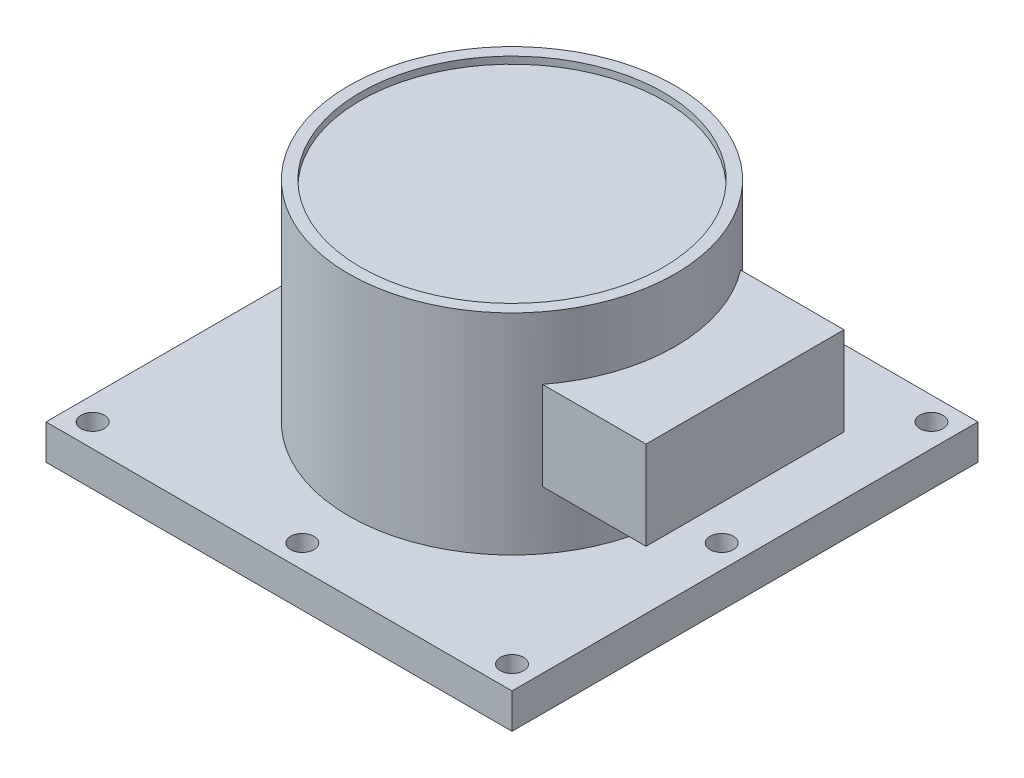
ISO-10303-21;
HEADER;
FILE_DESCRIPTION(('STEP AP214'),'2;1');
FILE_NAME('part.step','',(''),(''),'','','');
FILE_SCHEMA(('AUTOMOTIVE_DESIGN { 1 0 10303 214 1 1 1 1 }'));
ENDSEC;
DATA;
#1=APPLICATION_CONTEXT('core data for automotive mechanical design processes');
#2=APPLICATION_PROTOCOL_DEFINITION('international standard','automotive_design',2000,#1);
#3=PRODUCT_CONTEXT('',#1,'mechanical');
#4=PRODUCT('Part','Part','',(#3));
#5=PRODUCT_RELATED_PRODUCT_CATEGORY('part','',(#4));
#6=PRODUCT_DEFINITION_FORMATION('','',#4);
#7=PRODUCT_DEFINITION_CONTEXT('part definition',#1,'design');
#8=PRODUCT_DEFINITION('design','',#6,#7);
#9=PRODUCT_DEFINITION_SHAPE('','',#8);
#10=(LENGTH_UNIT() NAMED_UNIT(*) SI_UNIT(.MILLI.,.METRE.));
#11=(NAMED_UNIT(*) PLANE_ANGLE_UNIT() SI_UNIT($,.RADIAN.));
#12=(NAMED_UNIT(*) SI_UNIT($,.STERADIAN.) SOLID_ANGLE_UNIT());
#13=UNCERTAINTY_MEASURE_WITH_UNIT(LENGTH_MEASURE(1.E-05),#10,'distance_accuracy_value','');
#14=(GEOMETRIC_REPRESENTATION_CONTEXT(3) GLOBAL_UNCERTAINTY_ASSIGNED_CONTEXT((#13)) GLOBAL_UNIT_ASSIGNED_CONTEXT((#10,
#11,#12)) REPRESENTATION_CONTEXT('',''));
#15=CARTESIAN_POINT('',(0.,0.,0.));
#16=DIRECTION('',(0.,0.,1.));
#17=DIRECTION('',(1.,0.,0.));
#18=AXIS2_PLACEMENT_3D('',#15,#16,#17);
#19=CARTESIAN_POINT('',(0.,105.,0.));
#20=DIRECTION('',(0.,-1.,0.));
#21=DIRECTION('',(0.,0.,-1.));
#22=AXIS2_PLACEMENT_3D('',#19,#20,#21);
#23=CYLINDRICAL_SURFACE('',#22,70.);
#24=CARTESIAN_POINT('',(0.,15.,0.));
#25=DIRECTION('',(0.,1.,0.));
#26=DIRECTION('',(0.,0.,1.));
#27=AXIS2_PLACEMENT_3D('',#24,#25,#26);
#28=CIRCLE('',#27,70.);
#29=CARTESIAN_POINT('',(0.,15.,70.));
#30=VERTEX_POINT('',#29);
#31=EDGE_CURVE('E146',#30,#30,#28,.T.);
#32=ORIENTED_EDGE('',*,*,#31,.T.);
#33=EDGE_LOOP('',(#32));
#34=FACE_BOUND('',#33,.T.);
#35=CARTESIAN_POINT('',(0.,105.,0.));
#36=DIRECTION('',(0.,1.,0.));
#37=DIRECTION('',(0.,0.,1.));
#38=AXIS2_PLACEMENT_3D('',#35,#36,#37);
#39=CIRCLE('',#38,70.);
#40=CARTESIAN_POINT('',(0.,105.,70.));
#41=VERTEX_POINT('',#40);
#42=EDGE_CURVE('E141',#41,#41,#39,.T.);
#43=ORIENTED_EDGE('',*,*,#42,.F.);
#44=EDGE_LOOP('',(#43));
#45=FACE_BOUND('',#44,.T.);
#46=DIRECTION('',(0.,-1.,0.));
#47=VECTOR('',#46,1.);
#48=CARTESIAN_POINT('',(55.6214886532175,105.,42.5));
#49=LINE('',#48,#47);
#50=CARTESIAN_POINT('',(55.6214886532175,78.,42.5));
#51=VERTEX_POINT('',#50);
#52=CARTESIAN_POINT('',(55.6214886532175,40.,42.5));
#53=VERTEX_POINT('',#52);
#54=EDGE_CURVE('E11',#51,#53,#49,.T.);
#55=ORIENTED_EDGE('',*,*,#54,.F.);
#56=CARTESIAN_POINT('',(0.,78.,0.));
#57=DIRECTION('',(0.,1.,0.));
#58=DIRECTION('',(0.,0.,1.));
#59=AXIS2_PLACEMENT_3D('',#56,#57,#58);
#60=CIRCLE('',#59,70.);
#61=CARTESIAN_POINT('',(55.6214886532175,78.,-42.5));
#62=VERTEX_POINT('',#61);
#63=EDGE_CURVE('E149',#51,#62,#60,.T.);
#64=ORIENTED_EDGE('',*,*,#63,.T.);
#65=DIRECTION('',(0.,-1.,0.));
#66=VECTOR('',#65,1.);
#67=CARTESIAN_POINT('',(55.6214886532175,105.,-42.5));
#68=LINE('',#67,#66);
#69=CARTESIAN_POINT('',(55.6214886532175,40.,-42.5));
#70=VERTEX_POINT('',#69);
#71=EDGE_CURVE('E174',#62,#70,#68,.T.);
#72=ORIENTED_EDGE('',*,*,#71,.T.);
#73=CARTESIAN_POINT('',(0.,40.,0.));
#74=DIRECTION('',(0.,1.,0.));
#75=DIRECTION('',(0.,0.,1.));
#76=AXIS2_PLACEMENT_3D('',#73,#74,#75);
#77=CIRCLE('',#76,70.);
#78=EDGE_CURVE('E42',#53,#70,#77,.T.);
#79=ORIENTED_EDGE('',*,*,#78,.F.);
#80=EDGE_LOOP('',(#55,#64,#72,#79));
#81=FACE_BOUND('',#80,.T.);
#82=ADVANCED_FACE('F34',(#34,#45,#81),#23,.T.);
#83=CARTESIAN_POINT('',(100.,15.,100.));
#84=DIRECTION('',(-1.,0.,0.));
#85=DIRECTION('',(0.,0.,1.));
#86=AXIS2_PLACEMENT_3D('',#83,#84,#85);
#87=PLANE('',#86);
#88=DIRECTION('',(0.,0.,-1.));
#89=VECTOR('',#88,1.);
#90=CARTESIAN_POINT('',(100.,0.,100.));
#91=LINE('',#90,#89);
#92=CARTESIAN_POINT('',(100.,0.,100.));
#93=VERTEX_POINT('',#92);
#94=CARTESIAN_POINT('',(100.,0.,-100.));
#95=VERTEX_POINT('',#94);
#96=EDGE_CURVE('E145',#93,#95,#91,.T.);
#97=ORIENTED_EDGE('',*,*,#96,.T.);
#98=DIRECTION('',(0.,-1.,0.));
#99=VECTOR('',#98,1.);
#100=CARTESIAN_POINT('',(100.,15.,-100.));
#101=LINE('',#100,#99);
#102=CARTESIAN_POINT('',(100.,15.,-100.));
#103=VERTEX_POINT('',#102);
#104=EDGE_CURVE('E150',#103,#95,#101,.T.);
#105=ORIENTED_EDGE('',*,*,#104,.F.);
#106=DIRECTION('',(0.,0.,-1.));
#107=VECTOR('',#106,1.);
#108=CARTESIAN_POINT('',(100.,15.,100.));
#109=LINE('',#108,#107);
#110=CARTESIAN_POINT('',(100.,15.,100.));
#111=VERTEX_POINT('',#110);
#112=EDGE_CURVE('E151',#111,#103,#109,.T.);
#113=ORIENTED_EDGE('',*,*,#112,.F.);
#114=DIRECTION('',(0.,-1.,0.));
#115=VECTOR('',#114,1.);
#116=CARTESIAN_POINT('',(100.,15.,100.));
#117=LINE('',#116,#115);
#118=EDGE_CURVE('E157',#111,#93,#117,.T.);
#119=ORIENTED_EDGE('',*,*,#118,.T.);
#120=EDGE_LOOP('',(#97,#105,#113,#119));
#121=FACE_BOUND('',#120,.T.);
#122=ADVANCED_FACE('F36',(#121),#87,.F.);
#123=CARTESIAN_POINT('',(-100.,15.,-100.));
#124=DIRECTION('',(0.,0.,1.));
#125=DIRECTION('',(1.,0.,0.));
#126=AXIS2_PLACEMENT_3D('',#123,#124,#125);
#127=PLANE('',#126);
#128=DIRECTION('',(-1.,0.,0.));
#129=VECTOR('',#128,1.);
#130=CARTESIAN_POINT('',(-100.,0.,-100.));
#131=LINE('',#130,#129);
#132=CARTESIAN_POINT('',(-100.,0.,-100.));
#133=VERTEX_POINT('',#132);
#134=EDGE_CURVE('E160',#95,#133,#131,.T.);
#135=ORIENTED_EDGE('',*,*,#134,.T.);
#136=DIRECTION('',(0.,-1.,0.));
#137=VECTOR('',#136,1.);
#138=CARTESIAN_POINT('',(-100.,15.,-100.));
#139=LINE('',#138,#137);
#140=CARTESIAN_POINT('',(-100.,15.,-100.));
#141=VERTEX_POINT('',#140);
#142=EDGE_CURVE('E168',#141,#133,#139,.T.);
#143=ORIENTED_EDGE('',*,*,#142,.F.);
#144=DIRECTION('',(-1.,0.,0.));
#145=VECTOR('',#144,1.);
#146=CARTESIAN_POINT('',(-100.,15.,-100.));
#147=LINE('',#146,#145);
#148=EDGE_CURVE('E87',#103,#141,#147,.T.);
#149=ORIENTED_EDGE('',*,*,#148,.F.);
#150=ORIENTED_EDGE('',*,*,#104,.T.);
#151=EDGE_LOOP('',(#135,#143,#149,#150));
#152=FACE_BOUND('',#151,.T.);
#153=ADVANCED_FACE('F266',(#152),#127,.F.);
#154=CARTESIAN_POINT('',(-100.,15.,100.));
#155=DIRECTION('',(1.,0.,0.));
#156=DIRECTION('',(0.,0.,-1.));
#157=AXIS2_PLACEMENT_3D('',#154,#155,#156);
#158=PLANE('',#157);
#159=DIRECTION('',(0.,0.,1.));
#160=VECTOR('',#159,1.);
#161=CARTESIAN_POINT('',(-100.,0.,100.));
#162=LINE('',#161,#160);
#163=CARTESIAN_POINT('',(-100.,0.,100.));
#164=VERTEX_POINT('',#163);
#165=EDGE_CURVE('E162',#133,#164,#162,.T.);
#166=ORIENTED_EDGE('',*,*,#165,.T.);
#167=DIRECTION('',(0.,-1.,0.));
#168=VECTOR('',#167,1.);
#169=CARTESIAN_POINT('',(-100.,15.,100.));
#170=LINE('',#169,#168);
#171=CARTESIAN_POINT('',(-100.,15.,100.));
#172=VERTEX_POINT('',#171);
#173=EDGE_CURVE('E166',#172,#164,#170,.T.);
#174=ORIENTED_EDGE('',*,*,#173,.F.);
#175=DIRECTION('',(0.,0.,1.));
#176=VECTOR('',#175,1.);
#177=CARTESIAN_POINT('',(-100.,15.,100.));
#178=LINE('',#177,#176);
#179=EDGE_CURVE('E154',#141,#172,#178,.T.);
#180=ORIENTED_EDGE('',*,*,#179,.F.);
#181=ORIENTED_EDGE('',*,*,#142,.T.);
#182=EDGE_LOOP('',(#166,#174,#180,#181));
#183=FACE_BOUND('',#182,.T.);
#184=ADVANCED_FACE('F265',(#183),#158,.F.);
#185=CARTESIAN_POINT('',(-100.,15.,100.));
#186=DIRECTION('',(0.,0.,-1.));
#187=DIRECTION('',(-1.,0.,0.));
#188=AXIS2_PLACEMENT_3D('',#185,#186,#187);
#189=PLANE('',#188);
#190=DIRECTION('',(1.,0.,0.));
#191=VECTOR('',#190,1.);
#192=CARTESIAN_POINT('',(-100.,0.,100.));
#193=LINE('',#192,#191);
#194=EDGE_CURVE('E79',#164,#93,#193,.T.);
#195=ORIENTED_EDGE('',*,*,#194,.T.);
#196=ORIENTED_EDGE('',*,*,#118,.F.);
#197=DIRECTION('',(1.,0.,0.));
#198=VECTOR('',#197,1.);
#199=CARTESIAN_POINT('',(-100.,15.,100.));
#200=LINE('',#199,#198);
#201=EDGE_CURVE('E58',#172,#111,#200,.T.);
#202=ORIENTED_EDGE('',*,*,#201,.F.);
#203=ORIENTED_EDGE('',*,*,#173,.T.);
#204=EDGE_LOOP('',(#195,#196,#202,#203));
#205=FACE_BOUND('',#204,.T.);
#206=ADVANCED_FACE('F261',(#205),#189,.F.);
#207=CARTESIAN_POINT('',(0.,15.,0.));
#208=DIRECTION('',(0.,-1.,0.));
#209=DIRECTION('',(0.,0.,-1.));
#210=AXIS2_PLACEMENT_3D('',#207,#208,#209);
#211=PLANE('',#210);
#212=CARTESIAN_POINT('',(0.,15.,90.));
#213=DIRECTION('',(0.,-1.,0.));
#214=DIRECTION('',(0.,0.,-1.));
#215=AXIS2_PLACEMENT_3D('',#212,#213,#214);
#216=CIRCLE('',#215,5.);
#217=CARTESIAN_POINT('',(0.,15.,85.));
#218=VERTEX_POINT('',#217);
#219=EDGE_CURVE('E188',#218,#218,#216,.T.);
#220=ORIENTED_EDGE('',*,*,#219,.T.);
#221=EDGE_LOOP('',(#220));
#222=FACE_BOUND('',#221,.T.);
#223=CARTESIAN_POINT('',(90.,15.,90.));
#224=DIRECTION('',(0.,-1.,0.));
#225=DIRECTION('',(0.,0.,-1.));
#226=AXIS2_PLACEMENT_3D('',#223,#224,#225);
#227=CIRCLE('',#226,5.00000000000001);
#228=CARTESIAN_POINT('',(90.,15.,85.));
#229=VERTEX_POINT('',#228);
#230=EDGE_CURVE('E207',#229,#229,#227,.T.);
#231=ORIENTED_EDGE('',*,*,#230,.T.);
#232=EDGE_LOOP('',(#231));
#233=FACE_BOUND('',#232,.T.);
#234=CARTESIAN_POINT('',(90.,15.,0.));
#235=DIRECTION('',(0.,-1.,0.));
#236=DIRECTION('',(0.,0.,-1.));
#237=AXIS2_PLACEMENT_3D('',#234,#235,#236);
#238=CIRCLE('',#237,5.);
#239=CARTESIAN_POINT('',(90.,15.,-5.00000000000002));
#240=VERTEX_POINT('',#239);
#241=EDGE_CURVE('E201',#240,#240,#238,.T.);
#242=ORIENTED_EDGE('',*,*,#241,.T.);
#243=EDGE_LOOP('',(#242));
#244=FACE_BOUND('',#243,.T.);
#245=CARTESIAN_POINT('',(90.,15.,-90.));
#246=DIRECTION('',(0.,-1.,0.));
#247=DIRECTION('',(0.,0.,-1.));
#248=AXIS2_PLACEMENT_3D('',#245,#246,#247);
#249=CIRCLE('',#248,5.00000000000001);
#250=CARTESIAN_POINT('',(90.,15.,-95.));
#251=VERTEX_POINT('',#250);
#252=EDGE_CURVE('E194',#251,#251,#249,.T.);
#253=ORIENTED_EDGE('',*,*,#252,.T.);
#254=EDGE_LOOP('',(#253));
#255=FACE_BOUND('',#254,.T.);
#256=CARTESIAN_POINT('',(-90.,15.,-90.));
#257=DIRECTION('',(0.,-1.,0.));
#258=DIRECTION('',(0.,0.,-1.));
#259=AXIS2_PLACEMENT_3D('',#256,#257,#258);
#260=CIRCLE('',#259,5.00000000000001);
#261=CARTESIAN_POINT('',(-90.,15.,-95.));
#262=VERTEX_POINT('',#261);
#263=EDGE_CURVE('E195',#262,#262,#260,.T.);
#264=ORIENTED_EDGE('',*,*,#263,.T.);
#265=EDGE_LOOP('',(#264));
#266=FACE_BOUND('',#265,.T.);
#267=CARTESIAN_POINT('',(-90.,15.,0.));
#268=DIRECTION('',(0.,-1.,0.));
#269=DIRECTION('',(0.,0.,-1.));
#270=AXIS2_PLACEMENT_3D('',#267,#268,#269);
#271=CIRCLE('',#270,5.);
#272=CARTESIAN_POINT('',(-90.,15.,-5.00000000000002));
#273=VERTEX_POINT('',#272);
#274=EDGE_CURVE('E224',#273,#273,#271,.T.);
#275=ORIENTED_EDGE('',*,*,#274,.T.);
#276=EDGE_LOOP('',(#275));
#277=FACE_BOUND('',#276,.T.);
#278=CARTESIAN_POINT('',(0.,15.,-90.));
#279=DIRECTION('',(0.,-1.,0.));
#280=DIRECTION('',(0.,0.,-1.));
#281=AXIS2_PLACEMENT_3D('',#278,#279,#280);
#282=CIRCLE('',#281,5.);
#283=CARTESIAN_POINT('',(0.,15.,-95.));
#284=VERTEX_POINT('',#283);
#285=EDGE_CURVE('E218',#284,#284,#282,.T.);
#286=ORIENTED_EDGE('',*,*,#285,.T.);
#287=EDGE_LOOP('',(#286));
#288=FACE_BOUND('',#287,.T.);
#289=CARTESIAN_POINT('',(-90.,15.,90.));
#290=DIRECTION('',(0.,-1.,0.));
#291=DIRECTION('',(0.,0.,-1.));
#292=AXIS2_PLACEMENT_3D('',#289,#290,#291);
#293=CIRCLE('',#292,5.00000000000001);
#294=CARTESIAN_POINT('',(-90.,15.,85.));
#295=VERTEX_POINT('',#294);
#296=EDGE_CURVE('E128',#295,#295,#293,.T.);
#297=ORIENTED_EDGE('',*,*,#296,.T.);
#298=EDGE_LOOP('',(#297));
#299=FACE_BOUND('',#298,.T.);
#300=ORIENTED_EDGE('',*,*,#31,.F.);
#301=EDGE_LOOP('',(#300));
#302=FACE_BOUND('',#301,.T.);
#303=ORIENTED_EDGE('',*,*,#112,.T.);
#304=ORIENTED_EDGE('',*,*,#148,.T.);
#305=ORIENTED_EDGE('',*,*,#179,.T.);
#306=ORIENTED_EDGE('',*,*,#201,.T.);
#307=EDGE_LOOP('',(#303,#304,#305,#306));
#308=FACE_BOUND('',#307,.T.);
#309=ADVANCED_FACE('F233',(#222,#233,#244,#255,#266,#277,#288,#299,#302,#308),#211,.F.);
#310=CARTESIAN_POINT('',(0.,0.,0.));
#311=DIRECTION('',(0.,-1.,0.));
#312=DIRECTION('',(0.,0.,-1.));
#313=AXIS2_PLACEMENT_3D('',#310,#311,#312);
#314=PLANE('',#313);
#315=CARTESIAN_POINT('',(0.,0.,90.));
#316=DIRECTION('',(0.,-1.,0.));
#317=DIRECTION('',(0.,0.,-1.));
#318=AXIS2_PLACEMENT_3D('',#315,#316,#317);
#319=CIRCLE('',#318,5.);
#320=CARTESIAN_POINT('',(0.,0.,85.));
#321=VERTEX_POINT('',#320);
#322=EDGE_CURVE('E210',#321,#321,#319,.T.);
#323=ORIENTED_EDGE('',*,*,#322,.F.);
#324=EDGE_LOOP('',(#323));
#325=FACE_BOUND('',#324,.T.);
#326=CARTESIAN_POINT('',(90.,0.,90.));
#327=DIRECTION('',(0.,-1.,0.));
#328=DIRECTION('',(0.,0.,-1.));
#329=AXIS2_PLACEMENT_3D('',#326,#327,#328);
#330=CIRCLE('',#329,5.00000000000001);
#331=CARTESIAN_POINT('',(90.,0.,85.));
#332=VERTEX_POINT('',#331);
#333=EDGE_CURVE('E204',#332,#332,#330,.T.);
#334=ORIENTED_EDGE('',*,*,#333,.F.);
#335=EDGE_LOOP('',(#334));
#336=FACE_BOUND('',#335,.T.);
#337=CARTESIAN_POINT('',(90.,0.,0.));
#338=DIRECTION('',(0.,-1.,0.));
#339=DIRECTION('',(0.,0.,-1.));
#340=AXIS2_PLACEMENT_3D('',#337,#338,#339);
#341=CIRCLE('',#340,5.);
#342=CARTESIAN_POINT('',(90.,0.,-5.00000000000002));
#343=VERTEX_POINT('',#342);
#344=EDGE_CURVE('E198',#343,#343,#341,.T.);
#345=ORIENTED_EDGE('',*,*,#344,.F.);
#346=EDGE_LOOP('',(#345));
#347=FACE_BOUND('',#346,.T.);
#348=CARTESIAN_POINT('',(90.,0.,-90.));
#349=DIRECTION('',(0.,-1.,0.));
#350=DIRECTION('',(0.,0.,-1.));
#351=AXIS2_PLACEMENT_3D('',#348,#349,#350);
#352=CIRCLE('',#351,5.00000000000001);
#353=CARTESIAN_POINT('',(90.,0.,-95.));
#354=VERTEX_POINT('',#353);
#355=EDGE_CURVE('E191',#354,#354,#352,.T.);
#356=ORIENTED_EDGE('',*,*,#355,.F.);
#357=EDGE_LOOP('',(#356));
#358=FACE_BOUND('',#357,.T.);
#359=CARTESIAN_POINT('',(-90.,0.,-90.));
#360=DIRECTION('',(0.,-1.,0.));
#361=DIRECTION('',(0.,0.,-1.));
#362=AXIS2_PLACEMENT_3D('',#359,#360,#361);
#363=CIRCLE('',#362,5.00000000000001);
#364=CARTESIAN_POINT('',(-90.,0.,-95.));
#365=VERTEX_POINT('',#364);
#366=EDGE_CURVE('E227',#365,#365,#363,.T.);
#367=ORIENTED_EDGE('',*,*,#366,.F.);
#368=EDGE_LOOP('',(#367));
#369=FACE_BOUND('',#368,.T.);
#370=CARTESIAN_POINT('',(-90.,0.,0.));
#371=DIRECTION('',(0.,-1.,0.));
#372=DIRECTION('',(0.,0.,-1.));
#373=AXIS2_PLACEMENT_3D('',#370,#371,#372);
#374=CIRCLE('',#373,5.);
#375=CARTESIAN_POINT('',(-90.,0.,-5.00000000000002));
#376=VERTEX_POINT('',#375);
#377=EDGE_CURVE('E221',#376,#376,#374,.T.);
#378=ORIENTED_EDGE('',*,*,#377,.F.);
#379=EDGE_LOOP('',(#378));
#380=FACE_BOUND('',#379,.T.);
#381=CARTESIAN_POINT('',(0.,0.,-90.));
#382=DIRECTION('',(0.,-1.,0.));
#383=DIRECTION('',(0.,0.,-1.));
#384=AXIS2_PLACEMENT_3D('',#381,#382,#383);
#385=CIRCLE('',#384,5.);
#386=CARTESIAN_POINT('',(0.,0.,-95.));
#387=VERTEX_POINT('',#386);
#388=EDGE_CURVE('E215',#387,#387,#385,.T.);
#389=ORIENTED_EDGE('',*,*,#388,.F.);
#390=EDGE_LOOP('',(#389));
#391=FACE_BOUND('',#390,.T.);
#392=CARTESIAN_POINT('',(-90.,0.,90.));
#393=DIRECTION('',(0.,-1.,0.));
#394=DIRECTION('',(0.,0.,-1.));
#395=AXIS2_PLACEMENT_3D('',#392,#393,#394);
#396=CIRCLE('',#395,5.00000000000001);
#397=CARTESIAN_POINT('',(-90.,0.,85.));
#398=VERTEX_POINT('',#397);
#399=EDGE_CURVE('E185',#398,#398,#396,.T.);
#400=ORIENTED_EDGE('',*,*,#399,.F.);
#401=EDGE_LOOP('',(#400));
#402=FACE_BOUND('',#401,.T.);
#403=ORIENTED_EDGE('',*,*,#96,.F.);
#404=ORIENTED_EDGE('',*,*,#194,.F.);
#405=ORIENTED_EDGE('',*,*,#165,.F.);
#406=ORIENTED_EDGE('',*,*,#134,.F.);
#407=EDGE_LOOP('',(#403,#404,#405,#406));
#408=FACE_BOUND('',#407,.T.);
#409=ADVANCED_FACE('F244',(#325,#336,#347,#358,#369,#380,#391,#402,#408),#314,.T.);
#410=CARTESIAN_POINT('',(0.,105.,0.));
#411=DIRECTION('',(0.,1.,0.));
#412=DIRECTION('',(0.,0.,1.));
#413=AXIS2_PLACEMENT_3D('',#410,#411,#412);
#414=PLANE('',#413);
#415=CARTESIAN_POINT('',(0.,105.,0.));
#416=DIRECTION('',(0.,1.,0.));
#417=DIRECTION('',(0.,0.,1.));
#418=AXIS2_PLACEMENT_3D('',#415,#416,#417);
#419=CIRCLE('',#418,65.);
#420=CARTESIAN_POINT('',(0.,105.,65.));
#421=VERTEX_POINT('',#420);
#422=EDGE_CURVE('E132',#421,#421,#419,.T.);
#423=ORIENTED_EDGE('',*,*,#422,.F.);
#424=EDGE_LOOP('',(#423));
#425=FACE_BOUND('',#424,.T.);
#426=ORIENTED_EDGE('',*,*,#42,.T.);
#427=EDGE_LOOP('',(#426));
#428=FACE_BOUND('',#427,.T.);
#429=ADVANCED_FACE('F247',(#425,#428),#414,.T.);
#430=CARTESIAN_POINT('',(0.,102.,0.));
#431=DIRECTION('',(0.,1.,0.));
#432=DIRECTION('',(0.,0.,1.));
#433=AXIS2_PLACEMENT_3D('',#430,#431,#432);
#434=CYLINDRICAL_SURFACE('',#433,65.);
#435=CARTESIAN_POINT('',(0.,102.,0.));
#436=DIRECTION('',(0.,1.,0.));
#437=DIRECTION('',(0.,0.,1.));
#438=AXIS2_PLACEMENT_3D('',#435,#436,#437);
#439=CIRCLE('',#438,65.);
#440=CARTESIAN_POINT('',(0.,102.,65.));
#441=VERTEX_POINT('',#440);
#442=EDGE_CURVE('E135',#441,#441,#439,.T.);
#443=ORIENTED_EDGE('',*,*,#442,.F.);
#444=EDGE_LOOP('',(#443));
#445=FACE_BOUND('',#444,.T.);
#446=ORIENTED_EDGE('',*,*,#422,.T.);
#447=EDGE_LOOP('',(#446));
#448=FACE_BOUND('',#447,.T.);
#449=ADVANCED_FACE('F306',(#445,#448),#434,.F.);
#450=CARTESIAN_POINT('',(0.,102.,0.));
#451=DIRECTION('',(0.,1.,0.));
#452=DIRECTION('',(0.,0.,1.));
#453=AXIS2_PLACEMENT_3D('',#450,#451,#452);
#454=PLANE('',#453);
#455=ORIENTED_EDGE('',*,*,#442,.T.);
#456=EDGE_LOOP('',(#455));
#457=FACE_BOUND('',#456,.T.);
#458=ADVANCED_FACE('F313',(#457),#454,.T.);
#459=CARTESIAN_POINT('',(100.,78.,42.5));
#460=DIRECTION('',(0.,0.,-1.));
#461=DIRECTION('',(-1.,0.,0.));
#462=AXIS2_PLACEMENT_3D('',#459,#460,#461);
#463=PLANE('',#462);
#464=DIRECTION('',(-1.,0.,0.));
#465=VECTOR('',#464,1.);
#466=CARTESIAN_POINT('',(100.,78.,42.5));
#467=LINE('',#466,#465);
#468=CARTESIAN_POINT('',(100.,78.,42.5));
#469=VERTEX_POINT('',#468);
#470=EDGE_CURVE('E180',#469,#51,#467,.T.);
#471=ORIENTED_EDGE('',*,*,#470,.T.);
#472=ORIENTED_EDGE('',*,*,#54,.T.);
#473=DIRECTION('',(-1.,0.,0.));
#474=VECTOR('',#473,1.);
#475=CARTESIAN_POINT('',(100.,40.,42.5));
#476=LINE('',#475,#474);
#477=CARTESIAN_POINT('',(100.,40.,42.5));
#478=VERTEX_POINT('',#477);
#479=EDGE_CURVE('E112',#478,#53,#476,.T.);
#480=ORIENTED_EDGE('',*,*,#479,.F.);
#481=DIRECTION('',(0.,-1.,0.));
#482=VECTOR('',#481,1.);
#483=CARTESIAN_POINT('',(100.,78.,42.5));
#484=LINE('',#483,#482);
#485=EDGE_CURVE('E120',#469,#478,#484,.T.);
#486=ORIENTED_EDGE('',*,*,#485,.F.);
#487=EDGE_LOOP('',(#471,#472,#480,#486));
#488=FACE_BOUND('',#487,.T.);
#489=ADVANCED_FACE('F130',(#488),#463,.F.);
#490=CARTESIAN_POINT('',(100.,78.,-42.5));
#491=DIRECTION('',(0.,0.,-1.));
#492=DIRECTION('',(-1.,0.,0.));
#493=AXIS2_PLACEMENT_3D('',#490,#491,#492);
#494=PLANE('',#493);
#495=ORIENTED_EDGE('',*,*,#71,.F.);
#496=DIRECTION('',(-1.,0.,0.));
#497=VECTOR('',#496,1.);
#498=CARTESIAN_POINT('',(100.,78.,-42.5));
#499=LINE('',#498,#497);
#500=CARTESIAN_POINT('',(100.,78.,-42.5));
#501=VERTEX_POINT('',#500);
#502=EDGE_CURVE('E49',#501,#62,#499,.T.);
#503=ORIENTED_EDGE('',*,*,#502,.F.);
#504=DIRECTION('',(0.,-1.,0.));
#505=VECTOR('',#504,1.);
#506=CARTESIAN_POINT('',(100.,78.,-42.5));
#507=LINE('',#506,#505);
#508=CARTESIAN_POINT('',(100.,40.,-42.5));
#509=VERTEX_POINT('',#508);
#510=EDGE_CURVE('E119',#501,#509,#507,.T.);
#511=ORIENTED_EDGE('',*,*,#510,.T.);
#512=DIRECTION('',(-1.,0.,0.));
#513=VECTOR('',#512,1.);
#514=CARTESIAN_POINT('',(100.,40.,-42.5));
#515=LINE('',#514,#513);
#516=EDGE_CURVE('E115',#509,#70,#515,.T.);
#517=ORIENTED_EDGE('',*,*,#516,.T.);
#518=EDGE_LOOP('',(#495,#503,#511,#517));
#519=FACE_BOUND('',#518,.T.);
#520=ADVANCED_FACE('F178',(#519),#494,.T.);
#521=CARTESIAN_POINT('',(100.,40.,42.5));
#522=DIRECTION('',(0.,1.,0.));
#523=DIRECTION('',(0.,0.,1.));
#524=AXIS2_PLACEMENT_3D('',#521,#522,#523);
#525=PLANE('',#524);
#526=ORIENTED_EDGE('',*,*,#479,.T.);
#527=ORIENTED_EDGE('',*,*,#78,.T.);
#528=ORIENTED_EDGE('',*,*,#516,.F.);
#529=DIRECTION('',(0.,0.,-1.));
#530=VECTOR('',#529,1.);
#531=CARTESIAN_POINT('',(100.,40.,42.5));
#532=LINE('',#531,#530);
#533=EDGE_CURVE('E108',#478,#509,#532,.T.);
#534=ORIENTED_EDGE('',*,*,#533,.F.);
#535=EDGE_LOOP('',(#526,#527,#528,#534));
#536=FACE_BOUND('',#535,.T.);
#537=ADVANCED_FACE('F110',(#536),#525,.F.);
#538=CARTESIAN_POINT('',(100.,78.,42.5));
#539=DIRECTION('',(0.,1.,0.));
#540=DIRECTION('',(0.,0.,1.));
#541=AXIS2_PLACEMENT_3D('',#538,#539,#540);
#542=PLANE('',#541);
#543=ORIENTED_EDGE('',*,*,#63,.F.);
#544=ORIENTED_EDGE('',*,*,#470,.F.);
#545=DIRECTION('',(0.,0.,-1.));
#546=VECTOR('',#545,1.);
#547=CARTESIAN_POINT('',(100.,78.,42.5));
#548=LINE('',#547,#546);
#549=EDGE_CURVE('E125',#469,#501,#548,.T.);
#550=ORIENTED_EDGE('',*,*,#549,.T.);
#551=ORIENTED_EDGE('',*,*,#502,.T.);
#552=EDGE_LOOP('',(#543,#544,#550,#551));
#553=FACE_BOUND('',#552,.T.);
#554=ADVANCED_FACE('F179',(#553),#542,.T.);
#555=CARTESIAN_POINT('',(100.,0.,0.));
#556=DIRECTION('',(1.,0.,0.));
#557=DIRECTION('',(0.,0.,-1.));
#558=AXIS2_PLACEMENT_3D('',#555,#556,#557);
#559=PLANE('',#558);
#560=ORIENTED_EDGE('',*,*,#485,.T.);
#561=ORIENTED_EDGE('',*,*,#533,.T.);
#562=ORIENTED_EDGE('',*,*,#510,.F.);
#563=ORIENTED_EDGE('',*,*,#549,.F.);
#564=EDGE_LOOP('',(#560,#561,#562,#563));
#565=FACE_BOUND('',#564,.T.);
#566=ADVANCED_FACE('F124',(#565),#559,.T.);
#567=CARTESIAN_POINT('',(-90.,15.,90.));
#568=DIRECTION('',(0.,-1.,0.));
#569=DIRECTION('',(0.,0.,-1.));
#570=AXIS2_PLACEMENT_3D('',#567,#568,#569);
#571=CYLINDRICAL_SURFACE('',#570,5.00000000000001);
#572=ORIENTED_EDGE('',*,*,#296,.F.);
#573=EDGE_LOOP('',(#572));
#574=FACE_BOUND('',#573,.T.);
#575=ORIENTED_EDGE('',*,*,#399,.T.);
#576=EDGE_LOOP('',(#575));
#577=FACE_BOUND('',#576,.T.);
#578=ADVANCED_FACE('F350',(#574,#577),#571,.F.);
#579=CARTESIAN_POINT('',(0.,15.,-90.));
#580=DIRECTION('',(0.,-1.,0.));
#581=DIRECTION('',(0.,0.,-1.));
#582=AXIS2_PLACEMENT_3D('',#579,#580,#581);
#583=CYLINDRICAL_SURFACE('',#582,5.);
#584=ORIENTED_EDGE('',*,*,#285,.F.);
#585=EDGE_LOOP('',(#584));
#586=FACE_BOUND('',#585,.T.);
#587=ORIENTED_EDGE('',*,*,#388,.T.);
#588=EDGE_LOOP('',(#587));
#589=FACE_BOUND('',#588,.T.);
#590=ADVANCED_FACE('F356',(#586,#589),#583,.F.);
#591=CARTESIAN_POINT('',(-90.,15.,0.));
#592=DIRECTION('',(0.,-1.,0.));
#593=DIRECTION('',(0.,0.,-1.));
#594=AXIS2_PLACEMENT_3D('',#591,#592,#593);
#595=CYLINDRICAL_SURFACE('',#594,5.);
#596=ORIENTED_EDGE('',*,*,#274,.F.);
#597=EDGE_LOOP('',(#596));
#598=FACE_BOUND('',#597,.T.);
#599=ORIENTED_EDGE('',*,*,#377,.T.);
#600=EDGE_LOOP('',(#599));
#601=FACE_BOUND('',#600,.T.);
#602=ADVANCED_FACE('F240',(#598,#601),#595,.F.);
#603=CARTESIAN_POINT('',(-90.,15.,-90.));
#604=DIRECTION('',(0.,-1.,0.));
#605=DIRECTION('',(0.,0.,-1.));
#606=AXIS2_PLACEMENT_3D('',#603,#604,#605);
#607=CYLINDRICAL_SURFACE('',#606,5.00000000000001);
#608=ORIENTED_EDGE('',*,*,#263,.F.);
#609=EDGE_LOOP('',(#608));
#610=FACE_BOUND('',#609,.T.);
#611=ORIENTED_EDGE('',*,*,#366,.T.);
#612=EDGE_LOOP('',(#611));
#613=FACE_BOUND('',#612,.T.);
#614=ADVANCED_FACE('F236',(#610,#613),#607,.F.);
#615=CARTESIAN_POINT('',(90.,15.,-90.));
#616=DIRECTION('',(0.,-1.,0.));
#617=DIRECTION('',(0.,0.,-1.));
#618=AXIS2_PLACEMENT_3D('',#615,#616,#617);
#619=CYLINDRICAL_SURFACE('',#618,5.00000000000001);
#620=ORIENTED_EDGE('',*,*,#252,.F.);
#621=EDGE_LOOP('',(#620));
#622=FACE_BOUND('',#621,.T.);
#623=ORIENTED_EDGE('',*,*,#355,.T.);
#624=EDGE_LOOP('',(#623));
#625=FACE_BOUND('',#624,.T.);
#626=ADVANCED_FACE('F239',(#622,#625),#619,.F.);
#627=CARTESIAN_POINT('',(90.,15.,0.));
#628=DIRECTION('',(0.,-1.,0.));
#629=DIRECTION('',(0.,0.,-1.));
#630=AXIS2_PLACEMENT_3D('',#627,#628,#629);
#631=CYLINDRICAL_SURFACE('',#630,5.);
#632=ORIENTED_EDGE('',*,*,#241,.F.);
#633=EDGE_LOOP('',(#632));
#634=FACE_BOUND('',#633,.T.);
#635=ORIENTED_EDGE('',*,*,#344,.T.);
#636=EDGE_LOOP('',(#635));
#637=FACE_BOUND('',#636,.T.);
#638=ADVANCED_FACE('F382',(#634,#637),#631,.F.);
#639=CARTESIAN_POINT('',(90.,15.,90.));
#640=DIRECTION('',(0.,-1.,0.));
#641=DIRECTION('',(0.,0.,-1.));
#642=AXIS2_PLACEMENT_3D('',#639,#640,#641);
#643=CYLINDRICAL_SURFACE('',#642,5.00000000000001);
#644=ORIENTED_EDGE('',*,*,#230,.F.);
#645=EDGE_LOOP('',(#644));
#646=FACE_BOUND('',#645,.T.);
#647=ORIENTED_EDGE('',*,*,#333,.T.);
#648=EDGE_LOOP('',(#647));
#649=FACE_BOUND('',#648,.T.);
#650=ADVANCED_FACE('F390',(#646,#649),#643,.F.);
#651=CARTESIAN_POINT('',(0.,15.,90.));
#652=DIRECTION('',(0.,-1.,0.));
#653=DIRECTION('',(0.,0.,-1.));
#654=AXIS2_PLACEMENT_3D('',#651,#652,#653);
#655=CYLINDRICAL_SURFACE('',#654,5.);
#656=ORIENTED_EDGE('',*,*,#219,.F.);
#657=EDGE_LOOP('',(#656));
#658=FACE_BOUND('',#657,.T.);
#659=ORIENTED_EDGE('',*,*,#322,.T.);
#660=EDGE_LOOP('',(#659));
#661=FACE_BOUND('',#660,.T.);
#662=ADVANCED_FACE('F398',(#658,#661),#655,.F.);
#663=CLOSED_SHELL('',(#82,#122,#153,#184,#206,#309,#409,#429,#449,#458,#489,#520,#537,#554,#566,
#578,#590,#602,#614,#626,#638,#650,#662));
#664=MANIFOLD_SOLID_BREP('B2',#663);
#665=ADVANCED_BREP_SHAPE_REPRESENTATION('',(#18,#664),#14);
#666=SHAPE_DEFINITION_REPRESENTATION(#9,#665);
ENDSEC;
END-ISO-10303-21;
